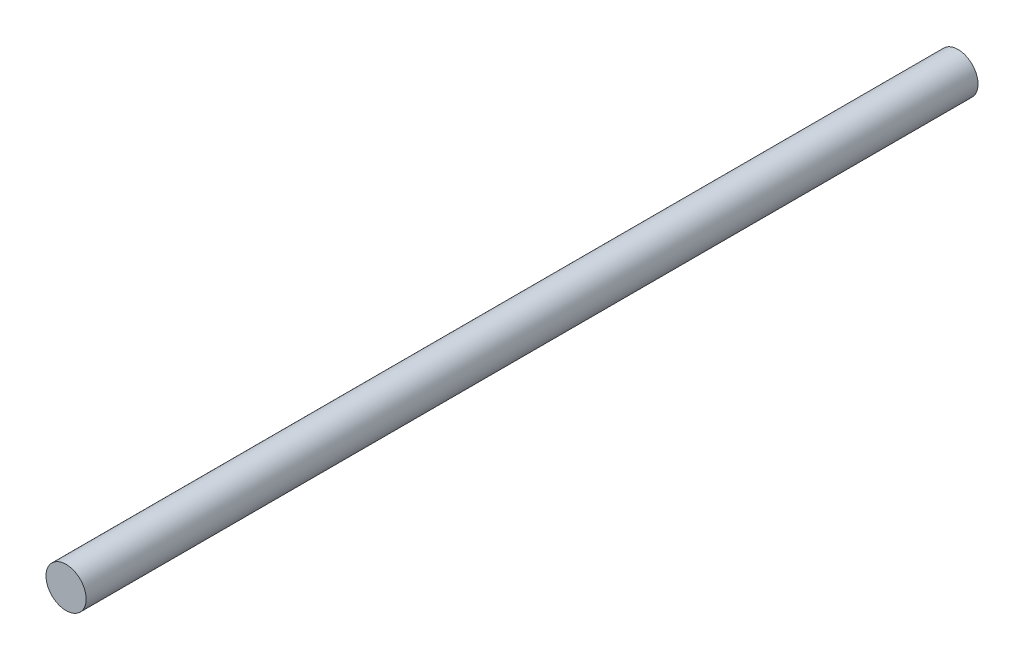
ISO-10303-21;
HEADER;
FILE_DESCRIPTION(('STEP AP214'),'2;1');
FILE_NAME('part.step','',(''),(''),'','','');
FILE_SCHEMA(('AUTOMOTIVE_DESIGN { 1 0 10303 214 1 1 1 1 }'));
ENDSEC;
DATA;
#1=APPLICATION_CONTEXT('core data for automotive mechanical design processes');
#2=APPLICATION_PROTOCOL_DEFINITION('international standard','automotive_design',2000,#1);
#3=PRODUCT_CONTEXT('',#1,'mechanical');
#4=PRODUCT('Part','Part','',(#3));
#5=PRODUCT_RELATED_PRODUCT_CATEGORY('part','',(#4));
#6=PRODUCT_DEFINITION_FORMATION('','',#4);
#7=PRODUCT_DEFINITION_CONTEXT('part definition',#1,'design');
#8=PRODUCT_DEFINITION('design','',#6,#7);
#9=PRODUCT_DEFINITION_SHAPE('','',#8);
#10=(LENGTH_UNIT() NAMED_UNIT(*) SI_UNIT(.MILLI.,.METRE.));
#11=(NAMED_UNIT(*) PLANE_ANGLE_UNIT() SI_UNIT($,.RADIAN.));
#12=(NAMED_UNIT(*) SI_UNIT($,.STERADIAN.) SOLID_ANGLE_UNIT());
#13=UNCERTAINTY_MEASURE_WITH_UNIT(LENGTH_MEASURE(1.E-05),#10,'distance_accuracy_value','');
#14=(GEOMETRIC_REPRESENTATION_CONTEXT(3) GLOBAL_UNCERTAINTY_ASSIGNED_CONTEXT((#13)) GLOBAL_UNIT_ASSIGNED_CONTEXT((#10,
#11,#12)) REPRESENTATION_CONTEXT('',''));
#15=CARTESIAN_POINT('',(0.,0.,0.));
#16=DIRECTION('',(0.,0.,1.));
#17=DIRECTION('',(1.,0.,0.));
#18=AXIS2_PLACEMENT_3D('',#15,#16,#17);
#19=CARTESIAN_POINT('',(-50.1311365597111,330.23809727896,317.5));
#20=DIRECTION('',(0.,0.,-1.));
#21=DIRECTION('',(-1.,0.,0.));
#22=AXIS2_PLACEMENT_3D('',#19,#20,#21);
#23=CYLINDRICAL_SURFACE('',#22,14.2875);
#24=CARTESIAN_POINT('',(-50.1311365597111,330.23809727896,317.5));
#25=DIRECTION('',(0.,0.,1.));
#26=DIRECTION('',(1.,0.,0.));
#27=AXIS2_PLACEMENT_3D('',#24,#25,#26);
#28=CIRCLE('',#27,14.2875);
#29=CARTESIAN_POINT('',(-64.4186365597111,330.23809727896,317.5));
#30=VERTEX_POINT('',#29);
#31=EDGE_CURVE('E10',#30,#30,#28,.T.);
#32=CARTESIAN_POINT('',(-50.1311365597111,330.23809727896,-317.5));
#33=DIRECTION('',(0.,0.,1.));
#34=DIRECTION('',(1.,0.,0.));
#35=AXIS2_PLACEMENT_3D('',#32,#33,#34);
#36=CIRCLE('',#35,14.2875);
#37=CARTESIAN_POINT('',(-64.4186365597111,330.23809727896,-317.5));
#38=VERTEX_POINT('',#37);
#39=EDGE_CURVE('E37',#38,#38,#36,.T.);
#40=CARTESIAN_POINT('',(-64.4186365597111,330.23809727896,317.5));
#41=CARTESIAN_POINT('',(-64.4186365597111,330.23809727896,310.885416666667));
#42=CARTESIAN_POINT('',(-64.4186365597111,330.23809727896,304.270833333333));
#43=CARTESIAN_POINT('',(-64.4186365597111,330.23809727896,291.041666666667));
#44=CARTESIAN_POINT('',(-64.4186365597111,330.23809727896,284.427083333333));
#45=CARTESIAN_POINT('',(-64.4186365597111,330.23809727896,271.197916666667));
#46=CARTESIAN_POINT('',(-64.4186365597111,330.23809727896,264.583333333333));
#47=CARTESIAN_POINT('',(-64.4186365597111,330.23809727896,251.354166666667));
#48=CARTESIAN_POINT('',(-64.4186365597111,330.23809727896,244.739583333333));
#49=CARTESIAN_POINT('',(-64.4186365597111,330.23809727896,231.510416666667));
#50=CARTESIAN_POINT('',(-64.4186365597111,330.23809727896,224.895833333333));
#51=CARTESIAN_POINT('',(-64.4186365597111,330.23809727896,211.666666666667));
#52=CARTESIAN_POINT('',(-64.4186365597111,330.23809727896,205.052083333333));
#53=CARTESIAN_POINT('',(-64.4186365597111,330.23809727896,191.822916666667));
#54=CARTESIAN_POINT('',(-64.4186365597111,330.23809727896,185.208333333333));
#55=CARTESIAN_POINT('',(-64.4186365597111,330.23809727896,171.979166666667));
#56=CARTESIAN_POINT('',(-64.4186365597111,330.23809727896,165.364583333333));
#57=CARTESIAN_POINT('',(-64.4186365597111,330.23809727896,152.135416666667));
#58=CARTESIAN_POINT('',(-64.4186365597111,330.23809727896,145.520833333333));
#59=CARTESIAN_POINT('',(-64.4186365597111,330.23809727896,132.291666666667));
#60=CARTESIAN_POINT('',(-64.4186365597111,330.23809727896,125.677083333333));
#61=CARTESIAN_POINT('',(-64.4186365597111,330.23809727896,112.447916666667));
#62=CARTESIAN_POINT('',(-64.4186365597111,330.23809727896,105.833333333333));
#63=CARTESIAN_POINT('',(-64.4186365597111,330.23809727896,92.6041666666666));
#64=CARTESIAN_POINT('',(-64.4186365597111,330.23809727896,85.9895833333332));
#65=CARTESIAN_POINT('',(-64.4186365597111,330.23809727896,72.7604166666666));
#66=CARTESIAN_POINT('',(-64.4186365597111,330.23809727896,66.1458333333333));
#67=CARTESIAN_POINT('',(-64.4186365597111,330.23809727896,52.9166666666666));
#68=CARTESIAN_POINT('',(-64.4186365597111,330.23809727896,46.3020833333332));
#69=CARTESIAN_POINT('',(-64.4186365597111,330.23809727896,33.0729166666666));
#70=CARTESIAN_POINT('',(-64.4186365597111,330.23809727896,26.4583333333332));
#71=CARTESIAN_POINT('',(-64.4186365597111,330.23809727896,13.2291666666665));
#72=CARTESIAN_POINT('',(-64.4186365597111,330.23809727896,6.61458333333322));
#73=CARTESIAN_POINT('',(-64.4186365597111,330.23809727896,-6.61458333333344));
#74=CARTESIAN_POINT('',(-64.4186365597111,330.23809727896,-13.2291666666668));
#75=CARTESIAN_POINT('',(-64.4186365597111,330.23809727896,-26.4583333333334));
#76=CARTESIAN_POINT('',(-64.4186365597111,330.23809727896,-33.0729166666668));
#77=CARTESIAN_POINT('',(-64.4186365597111,330.23809727896,-46.3020833333334));
#78=CARTESIAN_POINT('',(-64.4186365597111,330.23809727896,-52.9166666666668));
#79=CARTESIAN_POINT('',(-64.4186365597111,330.23809727896,-66.1458333333335));
#80=CARTESIAN_POINT('',(-64.4186365597111,330.23809727896,-72.7604166666668));
#81=CARTESIAN_POINT('',(-64.4186365597111,330.23809727896,-85.9895833333335));
#82=CARTESIAN_POINT('',(-64.4186365597111,330.23809727896,-92.6041666666668));
#83=CARTESIAN_POINT('',(-64.4186365597111,330.23809727896,-105.833333333333));
#84=CARTESIAN_POINT('',(-64.4186365597111,330.23809727896,-112.447916666667));
#85=CARTESIAN_POINT('',(-64.4186365597111,330.23809727896,-125.677083333334));
#86=CARTESIAN_POINT('',(-64.4186365597111,330.23809727896,-132.291666666667));
#87=CARTESIAN_POINT('',(-64.4186365597111,330.23809727896,-145.520833333334));
#88=CARTESIAN_POINT('',(-64.4186365597111,330.23809727896,-152.135416666667));
#89=CARTESIAN_POINT('',(-64.4186365597111,330.23809727896,-165.364583333334));
#90=CARTESIAN_POINT('',(-64.4186365597111,330.23809727896,-171.979166666667));
#91=CARTESIAN_POINT('',(-64.4186365597111,330.23809727896,-185.208333333333));
#92=CARTESIAN_POINT('',(-64.4186365597111,330.23809727896,-191.822916666667));
#93=CARTESIAN_POINT('',(-64.4186365597111,330.23809727896,-205.052083333333));
#94=CARTESIAN_POINT('',(-64.4186365597111,330.23809727896,-211.666666666667));
#95=CARTESIAN_POINT('',(-64.4186365597111,330.23809727896,-224.895833333333));
#96=CARTESIAN_POINT('',(-64.4186365597111,330.23809727896,-231.510416666667));
#97=CARTESIAN_POINT('',(-64.4186365597111,330.23809727896,-244.739583333333));
#98=CARTESIAN_POINT('',(-64.4186365597111,330.23809727896,-251.354166666667));
#99=CARTESIAN_POINT('',(-64.4186365597111,330.23809727896,-264.583333333333));
#100=CARTESIAN_POINT('',(-64.4186365597111,330.23809727896,-271.197916666667));
#101=CARTESIAN_POINT('',(-64.4186365597111,330.23809727896,-284.427083333333));
#102=CARTESIAN_POINT('',(-64.4186365597111,330.23809727896,-291.041666666667));
#103=CARTESIAN_POINT('',(-64.4186365597111,330.23809727896,-304.270833333333));
#104=CARTESIAN_POINT('',(-64.4186365597111,330.23809727896,-310.885416666667));
#105=CARTESIAN_POINT('',(-64.4186365597111,330.23809727896,-317.5));
#106=B_SPLINE_CURVE_WITH_KNOTS('',3,(#40,#41,#42,#43,#44,#45,#46,#47,#48,#49,#50,#51,#52,#53,
#54,#55,#56,#57,#58,#59,#60,#61,#62,#63,#64,#65,#66,#67,#68,#69,#70,#71,#72,#73,#74,#75,#76,#77,
#78,#79,#80,#81,#82,#83,#84,#85,#86,#87,#88,#89,#90,#91,#92,#93,#94,#95,#96,#97,#98,#99,#100,
#101,#102,#103,#104,#105),.UNSPECIFIED.,.F.,.F.,(4,2,2,2,2,2,2,2,2,2,2,2,2,2,2,2,2,2,2,2,2,2,2,
2,2,2,2,2,2,2,2,2,4),(0.,19.84375,39.6875,59.53125,79.375,99.21875,119.0625,138.90625,158.75,
178.59375,198.4375,218.28125,238.125,257.96875,277.8125,297.65625,317.5,337.34375,357.1875,
377.03125,396.875,416.71875,436.5625,456.40625,476.25,496.09375,515.9375,535.78125,555.625,
575.46875,595.3125,615.15625,635.),.UNSPECIFIED.);
#107=EDGE_CURVE('BSEAM40',#30,#38,#106,.T.);
#108=ORIENTED_EDGE('',*,*,#31,.F.);
#109=ORIENTED_EDGE('',*,*,#39,.T.);
#110=ORIENTED_EDGE('',*,*,#107,.T.);
#111=ORIENTED_EDGE('',*,*,#107,.F.);
#112=EDGE_LOOP('',(#108,#110,#109,#111));
#113=FACE_BOUND('',#112,.T.);
#114=ADVANCED_FACE('F40',(#113),#23,.T.);
#115=CARTESIAN_POINT('',(-50.1311365597111,330.23809727896,317.5));
#116=DIRECTION('',(0.,0.,1.));
#117=DIRECTION('',(1.,0.,0.));
#118=AXIS2_PLACEMENT_3D('',#115,#116,#117);
#119=PLANE('',#118);
#120=ORIENTED_EDGE('',*,*,#31,.T.);
#121=EDGE_LOOP('',(#120));
#122=FACE_BOUND('',#121,.T.);
#123=ADVANCED_FACE('F55',(#122),#119,.T.);
#124=CARTESIAN_POINT('',(-50.1311365597111,330.23809727896,-317.5));
#125=DIRECTION('',(0.,0.,1.));
#126=DIRECTION('',(1.,0.,0.));
#127=AXIS2_PLACEMENT_3D('',#124,#125,#126);
#128=PLANE('',#127);
#129=ORIENTED_EDGE('',*,*,#39,.F.);
#130=EDGE_LOOP('',(#129));
#131=FACE_BOUND('',#130,.T.);
#132=ADVANCED_FACE('F49',(#131),#128,.F.);
#133=CLOSED_SHELL('',(#114,#123,#132));
#134=MANIFOLD_SOLID_BREP('B2',#133);
#135=ADVANCED_BREP_SHAPE_REPRESENTATION('',(#18,#134),#14);
#136=SHAPE_DEFINITION_REPRESENTATION(#9,#135);
ENDSEC;
END-ISO-10303-21;
